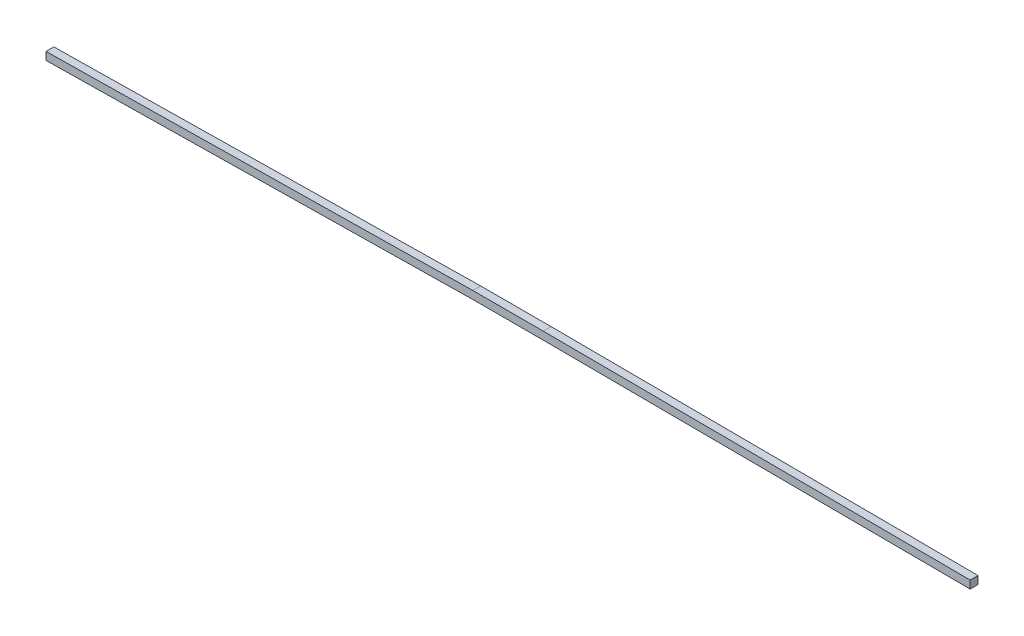
ISO-10303-21;
HEADER;
FILE_DESCRIPTION(('STEP AP214'),'2;1');
FILE_NAME('part.step','',(''),(''),'','','');
FILE_SCHEMA(('AUTOMOTIVE_DESIGN { 1 0 10303 214 1 1 1 1 }'));
ENDSEC;
DATA;
#1=APPLICATION_CONTEXT('core data for automotive mechanical design processes');
#2=APPLICATION_PROTOCOL_DEFINITION('international standard','automotive_design',2000,#1);
#3=PRODUCT_CONTEXT('',#1,'mechanical');
#4=PRODUCT('Part','Part','',(#3));
#5=PRODUCT_RELATED_PRODUCT_CATEGORY('part','',(#4));
#6=PRODUCT_DEFINITION_FORMATION('','',#4);
#7=PRODUCT_DEFINITION_CONTEXT('part definition',#1,'design');
#8=PRODUCT_DEFINITION('design','',#6,#7);
#9=PRODUCT_DEFINITION_SHAPE('','',#8);
#10=(LENGTH_UNIT() NAMED_UNIT(*) SI_UNIT(.MILLI.,.METRE.));
#11=(NAMED_UNIT(*) PLANE_ANGLE_UNIT() SI_UNIT($,.RADIAN.));
#12=(NAMED_UNIT(*) SI_UNIT($,.STERADIAN.) SOLID_ANGLE_UNIT());
#13=UNCERTAINTY_MEASURE_WITH_UNIT(LENGTH_MEASURE(1.E-05),#10,'distance_accuracy_value','');
#14=(GEOMETRIC_REPRESENTATION_CONTEXT(3) GLOBAL_UNCERTAINTY_ASSIGNED_CONTEXT((#13)) GLOBAL_UNIT_ASSIGNED_CONTEXT((#10,
#11,#12)) REPRESENTATION_CONTEXT('',''));
#15=CARTESIAN_POINT('',(0.,0.,0.));
#16=DIRECTION('',(0.,0.,1.));
#17=DIRECTION('',(1.,0.,0.));
#18=AXIS2_PLACEMENT_3D('',#15,#16,#17);
#19=CARTESIAN_POINT('',(775.81632877812,179.279481505801,5.));
#20=DIRECTION('',(-1.,0.,0.));
#21=DIRECTION('',(0.,0.,1.));
#22=AXIS2_PLACEMENT_3D('',#19,#20,#21);
#23=PLANE('',#22);
#24=DIRECTION('',(0.,1.,0.));
#25=VECTOR('',#24,1.);
#26=CARTESIAN_POINT('',(775.81632877812,179.279481505801,0.));
#27=LINE('',#26,#25);
#28=CARTESIAN_POINT('',(775.81632877812,174.279481505801,0.));
#29=VERTEX_POINT('',#28);
#30=CARTESIAN_POINT('',(775.81632877812,179.279481505801,0.));
#31=VERTEX_POINT('',#30);
#32=EDGE_CURVE('E129',#29,#31,#27,.T.);
#33=ORIENTED_EDGE('',*,*,#32,.T.);
#34=DIRECTION('',(0.,0.,-1.));
#35=VECTOR('',#34,1.);
#36=CARTESIAN_POINT('',(775.81632877812,179.279481505801,5.));
#37=LINE('',#36,#35);
#38=CARTESIAN_POINT('',(775.81632877812,179.279481505801,5.));
#39=VERTEX_POINT('',#38);
#40=EDGE_CURVE('E11',#39,#31,#37,.T.);
#41=ORIENTED_EDGE('',*,*,#40,.F.);
#42=DIRECTION('',(0.,1.,0.));
#43=VECTOR('',#42,1.);
#44=CARTESIAN_POINT('',(775.81632877812,179.279481505801,5.));
#45=LINE('',#44,#43);
#46=CARTESIAN_POINT('',(775.81632877812,174.279481505801,5.));
#47=VERTEX_POINT('',#46);
#48=EDGE_CURVE('E143',#47,#39,#45,.T.);
#49=ORIENTED_EDGE('',*,*,#48,.F.);
#50=DIRECTION('',(0.,0.,-1.));
#51=VECTOR('',#50,1.);
#52=CARTESIAN_POINT('',(775.81632877812,174.279481505801,5.));
#53=LINE('',#52,#51);
#54=EDGE_CURVE('E125',#47,#29,#53,.T.);
#55=ORIENTED_EDGE('',*,*,#54,.T.);
#56=EDGE_LOOP('',(#33,#41,#49,#55));
#57=FACE_BOUND('',#56,.T.);
#58=ADVANCED_FACE('F33',(#57),#23,.F.);
#59=CARTESIAN_POINT('',(775.81632877812,179.279481505801,5.));
#60=DIRECTION('',(-0.00498900007575145,-0.999987554861681,0.));
#61=DIRECTION('',(0.999987554861681,-0.00498900007575145,0.));
#62=AXIS2_PLACEMENT_3D('',#59,#60,#61);
#63=PLANE('',#62);
#64=DIRECTION('',(-0.999987554861681,0.00498900007575145,0.));
#65=VECTOR('',#64,1.);
#66=CARTESIAN_POINT('',(775.81632877812,179.279481505801,0.));
#67=LINE('',#66,#65);
#68=CARTESIAN_POINT('',(503.220006075733,180.639481505801,0.));
#69=VERTEX_POINT('',#68);
#70=EDGE_CURVE('E132',#31,#69,#67,.T.);
#71=ORIENTED_EDGE('',*,*,#70,.T.);
#72=DIRECTION('',(0.,0.,-1.));
#73=VECTOR('',#72,1.);
#74=CARTESIAN_POINT('',(503.220006075733,180.639481505801,5.));
#75=LINE('',#74,#73);
#76=CARTESIAN_POINT('',(503.220006075733,180.639481505801,5.));
#77=VERTEX_POINT('',#76);
#78=EDGE_CURVE('E41',#77,#69,#75,.T.);
#79=ORIENTED_EDGE('',*,*,#78,.F.);
#80=DIRECTION('',(-0.999987554861681,0.00498900007575145,0.));
#81=VECTOR('',#80,1.);
#82=CARTESIAN_POINT('',(775.81632877812,179.279481505801,5.));
#83=LINE('',#82,#81);
#84=EDGE_CURVE('E92',#39,#77,#83,.T.);
#85=ORIENTED_EDGE('',*,*,#84,.F.);
#86=ORIENTED_EDGE('',*,*,#40,.T.);
#87=EDGE_LOOP('',(#71,#79,#85,#86));
#88=FACE_BOUND('',#87,.T.);
#89=ADVANCED_FACE('F178',(#88),#63,.F.);
#90=CARTESIAN_POINT('',(503.220006075733,180.639481505801,5.));
#91=DIRECTION('',(0.,-1.,0.));
#92=DIRECTION('',(0.,0.,-1.));
#93=AXIS2_PLACEMENT_3D('',#90,#91,#92);
#94=PLANE('',#93);
#95=DIRECTION('',(-1.,0.,0.));
#96=VECTOR('',#95,1.);
#97=CARTESIAN_POINT('',(503.220006075733,180.639481505801,0.));
#98=LINE('',#97,#96);
#99=CARTESIAN_POINT('',(458.220006075733,180.639481505801,0.));
#100=VERTEX_POINT('',#99);
#101=EDGE_CURVE('E134',#69,#100,#98,.T.);
#102=ORIENTED_EDGE('',*,*,#101,.T.);
#103=DIRECTION('',(0.,0.,-1.));
#104=VECTOR('',#103,1.);
#105=CARTESIAN_POINT('',(458.220006075733,180.639481505801,5.));
#106=LINE('',#105,#104);
#107=CARTESIAN_POINT('',(458.220006075733,180.639481505801,5.));
#108=VERTEX_POINT('',#107);
#109=EDGE_CURVE('E150',#108,#100,#106,.T.);
#110=ORIENTED_EDGE('',*,*,#109,.F.);
#111=DIRECTION('',(-1.,0.,0.));
#112=VECTOR('',#111,1.);
#113=CARTESIAN_POINT('',(503.220006075733,180.639481505801,5.));
#114=LINE('',#113,#112);
#115=EDGE_CURVE('E158',#77,#108,#114,.T.);
#116=ORIENTED_EDGE('',*,*,#115,.F.);
#117=ORIENTED_EDGE('',*,*,#78,.T.);
#118=EDGE_LOOP('',(#102,#110,#116,#117));
#119=FACE_BOUND('',#118,.T.);
#120=ADVANCED_FACE('F156',(#119),#94,.F.);
#121=CARTESIAN_POINT('',(185.6508233039,176.559609699164,5.));
#122=DIRECTION('',(0.0149665299649783,-0.999887995217868,0.));
#123=DIRECTION('',(0.999887995217868,0.0149665299649783,0.));
#124=AXIS2_PLACEMENT_3D('',#121,#122,#123);
#125=PLANE('',#124);
#126=DIRECTION('',(-0.999887995217868,-0.0149665299649783,0.));
#127=VECTOR('',#126,1.);
#128=CARTESIAN_POINT('',(185.6508233039,176.559609699164,0.));
#129=LINE('',#128,#127);
#130=CARTESIAN_POINT('',(185.6508233039,176.559609699164,0.));
#131=VERTEX_POINT('',#130);
#132=EDGE_CURVE('E136',#100,#131,#129,.T.);
#133=ORIENTED_EDGE('',*,*,#132,.T.);
#134=DIRECTION('',(0.,0.,-1.));
#135=VECTOR('',#134,1.);
#136=CARTESIAN_POINT('',(185.6508233039,176.559609699164,5.));
#137=LINE('',#136,#135);
#138=CARTESIAN_POINT('',(185.6508233039,176.559609699164,5.));
#139=VERTEX_POINT('',#138);
#140=EDGE_CURVE('E147',#139,#131,#137,.T.);
#141=ORIENTED_EDGE('',*,*,#140,.F.);
#142=DIRECTION('',(-0.999887995217868,-0.0149665299649783,0.));
#143=VECTOR('',#142,1.);
#144=CARTESIAN_POINT('',(185.6508233039,176.559609699164,5.));
#145=LINE('',#144,#143);
#146=EDGE_CURVE('E170',#108,#139,#145,.T.);
#147=ORIENTED_EDGE('',*,*,#146,.F.);
#148=ORIENTED_EDGE('',*,*,#109,.T.);
#149=EDGE_LOOP('',(#133,#141,#147,#148));
#150=FACE_BOUND('',#149,.T.);
#151=ADVANCED_FACE('F166',(#150),#125,.F.);
#152=CARTESIAN_POINT('',(185.6508233039,176.559609699164,5.));
#153=DIRECTION('',(1.,0.,0.));
#154=DIRECTION('',(0.,0.,-1.));
#155=AXIS2_PLACEMENT_3D('',#152,#153,#154);
#156=PLANE('',#155);
#157=DIRECTION('',(0.,-1.,0.));
#158=VECTOR('',#157,1.);
#159=CARTESIAN_POINT('',(185.6508233039,176.559609699164,0.));
#160=LINE('',#159,#158);
#161=CARTESIAN_POINT('',(185.6508233039,171.559609699164,0.));
#162=VERTEX_POINT('',#161);
#163=EDGE_CURVE('E138',#131,#162,#160,.T.);
#164=ORIENTED_EDGE('',*,*,#163,.T.);
#165=DIRECTION('',(0.,0.,-1.));
#166=VECTOR('',#165,1.);
#167=CARTESIAN_POINT('',(185.6508233039,171.559609699164,5.));
#168=LINE('',#167,#166);
#169=CARTESIAN_POINT('',(185.6508233039,171.559609699164,5.));
#170=VERTEX_POINT('',#169);
#171=EDGE_CURVE('E120',#170,#162,#168,.T.);
#172=ORIENTED_EDGE('',*,*,#171,.F.);
#173=DIRECTION('',(0.,-1.,0.));
#174=VECTOR('',#173,1.);
#175=CARTESIAN_POINT('',(185.6508233039,176.559609699164,5.));
#176=LINE('',#175,#174);
#177=EDGE_CURVE('E111',#139,#170,#176,.T.);
#178=ORIENTED_EDGE('',*,*,#177,.F.);
#179=ORIENTED_EDGE('',*,*,#140,.T.);
#180=EDGE_LOOP('',(#164,#172,#178,#179));
#181=FACE_BOUND('',#180,.T.);
#182=ADVANCED_FACE('F169',(#181),#156,.F.);
#183=CARTESIAN_POINT('',(185.6508233039,171.559609699164,5.));
#184=DIRECTION('',(-0.0149644763768867,0.999888025954289,0.));
#185=DIRECTION('',(-0.999888025954289,-0.0149644763768867,0.));
#186=AXIS2_PLACEMENT_3D('',#183,#184,#185);
#187=PLANE('',#186);
#188=DIRECTION('',(0.999888025954289,0.0149644763768867,0.));
#189=VECTOR('',#188,1.);
#190=CARTESIAN_POINT('',(185.6508233039,171.559609699164,0.));
#191=LINE('',#190,#189);
#192=CARTESIAN_POINT('',(458.294828457618,175.640041376029,0.));
#193=VERTEX_POINT('',#192);
#194=EDGE_CURVE('E119',#162,#193,#191,.T.);
#195=ORIENTED_EDGE('',*,*,#194,.T.);
#196=DIRECTION('',(0.,0.,-1.));
#197=VECTOR('',#196,1.);
#198=CARTESIAN_POINT('',(458.294828457618,175.640041376029,5.));
#199=LINE('',#198,#197);
#200=CARTESIAN_POINT('',(458.294828457618,175.640041376029,5.));
#201=VERTEX_POINT('',#200);
#202=EDGE_CURVE('E116',#201,#193,#199,.T.);
#203=ORIENTED_EDGE('',*,*,#202,.F.);
#204=DIRECTION('',(0.999888025954289,0.0149644763768867,0.));
#205=VECTOR('',#204,1.);
#206=CARTESIAN_POINT('',(185.6508233039,171.559609699164,5.));
#207=LINE('',#206,#205);
#208=EDGE_CURVE('E105',#170,#201,#207,.T.);
#209=ORIENTED_EDGE('',*,*,#208,.F.);
#210=ORIENTED_EDGE('',*,*,#171,.T.);
#211=EDGE_LOOP('',(#195,#203,#209,#210));
#212=FACE_BOUND('',#211,.T.);
#213=ADVANCED_FACE('F117',(#212),#187,.F.);
#214=CARTESIAN_POINT('',(458.294828457618,175.640041376029,5.));
#215=DIRECTION('',(0.,1.,0.));
#216=DIRECTION('',(0.,0.,1.));
#217=AXIS2_PLACEMENT_3D('',#214,#215,#216);
#218=PLANE('',#217);
#219=DIRECTION('',(1.,0.,0.));
#220=VECTOR('',#219,1.);
#221=CARTESIAN_POINT('',(458.294828457618,175.640041376029,0.));
#222=LINE('',#221,#220);
#223=CARTESIAN_POINT('',(503.294828457618,175.640041376029,0.));
#224=VERTEX_POINT('',#223);
#225=EDGE_CURVE('E78',#193,#224,#222,.T.);
#226=ORIENTED_EDGE('',*,*,#225,.T.);
#227=DIRECTION('',(0.,0.,-1.));
#228=VECTOR('',#227,1.);
#229=CARTESIAN_POINT('',(503.294828457618,175.640041376029,5.));
#230=LINE('',#229,#228);
#231=CARTESIAN_POINT('',(503.294828457618,175.640041376029,5.));
#232=VERTEX_POINT('',#231);
#233=EDGE_CURVE('E121',#232,#224,#230,.T.);
#234=ORIENTED_EDGE('',*,*,#233,.F.);
#235=DIRECTION('',(1.,0.,0.));
#236=VECTOR('',#235,1.);
#237=CARTESIAN_POINT('',(458.294828457618,175.640041376029,5.));
#238=LINE('',#237,#236);
#239=EDGE_CURVE('E109',#201,#232,#238,.T.);
#240=ORIENTED_EDGE('',*,*,#239,.F.);
#241=ORIENTED_EDGE('',*,*,#202,.T.);
#242=EDGE_LOOP('',(#226,#234,#240,#241));
#243=FACE_BOUND('',#242,.T.);
#244=ADVANCED_FACE('F123',(#243),#218,.F.);
#245=CARTESIAN_POINT('',(775.81632877812,174.279481505801,5.));
#246=DIRECTION('',(0.00499242413175625,0.999987537772991,0.));
#247=DIRECTION('',(-0.999987537772991,0.00499242413175625,0.));
#248=AXIS2_PLACEMENT_3D('',#245,#246,#247);
#249=PLANE('',#248);
#250=DIRECTION('',(0.999987537772991,-0.00499242413175625,0.));
#251=VECTOR('',#250,1.);
#252=CARTESIAN_POINT('',(775.81632877812,174.279481505801,0.));
#253=LINE('',#252,#251);
#254=EDGE_CURVE('E84',#224,#29,#253,.T.);
#255=ORIENTED_EDGE('',*,*,#254,.T.);
#256=ORIENTED_EDGE('',*,*,#54,.F.);
#257=DIRECTION('',(0.999987537772991,-0.00499242413175625,0.));
#258=VECTOR('',#257,1.);
#259=CARTESIAN_POINT('',(775.81632877812,174.279481505801,5.));
#260=LINE('',#259,#258);
#261=EDGE_CURVE('E49',#232,#47,#260,.T.);
#262=ORIENTED_EDGE('',*,*,#261,.F.);
#263=ORIENTED_EDGE('',*,*,#233,.T.);
#264=EDGE_LOOP('',(#255,#256,#262,#263));
#265=FACE_BOUND('',#264,.T.);
#266=ADVANCED_FACE('F194',(#265),#249,.F.);
#267=CARTESIAN_POINT('',(0.,0.,5.));
#268=DIRECTION('',(0.,0.,1.));
#269=DIRECTION('',(1.,0.,0.));
#270=AXIS2_PLACEMENT_3D('',#267,#268,#269);
#271=PLANE('',#270);
#272=ORIENTED_EDGE('',*,*,#48,.T.);
#273=ORIENTED_EDGE('',*,*,#84,.T.);
#274=ORIENTED_EDGE('',*,*,#115,.T.);
#275=ORIENTED_EDGE('',*,*,#146,.T.);
#276=ORIENTED_EDGE('',*,*,#177,.T.);
#277=ORIENTED_EDGE('',*,*,#208,.T.);
#278=ORIENTED_EDGE('',*,*,#239,.T.);
#279=ORIENTED_EDGE('',*,*,#261,.T.);
#280=EDGE_LOOP('',(#272,#273,#274,#275,#276,#277,#278,#279));
#281=FACE_BOUND('',#280,.T.);
#282=ADVANCED_FACE('F107',(#281),#271,.T.);
#283=CARTESIAN_POINT('',(0.,0.,0.));
#284=DIRECTION('',(0.,0.,1.));
#285=DIRECTION('',(1.,0.,0.));
#286=AXIS2_PLACEMENT_3D('',#283,#284,#285);
#287=PLANE('',#286);
#288=ORIENTED_EDGE('',*,*,#32,.F.);
#289=ORIENTED_EDGE('',*,*,#254,.F.);
#290=ORIENTED_EDGE('',*,*,#225,.F.);
#291=ORIENTED_EDGE('',*,*,#194,.F.);
#292=ORIENTED_EDGE('',*,*,#163,.F.);
#293=ORIENTED_EDGE('',*,*,#132,.F.);
#294=ORIENTED_EDGE('',*,*,#101,.F.);
#295=ORIENTED_EDGE('',*,*,#70,.F.);
#296=EDGE_LOOP('',(#288,#289,#290,#291,#292,#293,#294,#295));
#297=FACE_BOUND('',#296,.T.);
#298=ADVANCED_FACE('F162',(#297),#287,.F.);
#299=CLOSED_SHELL('',(#58,#89,#120,#151,#182,#213,#244,#266,#282,#298));
#300=MANIFOLD_SOLID_BREP('B2',#299);
#301=ADVANCED_BREP_SHAPE_REPRESENTATION('',(#18,#300),#14);
#302=SHAPE_DEFINITION_REPRESENTATION(#9,#301);
ENDSEC;
END-ISO-10303-21;
